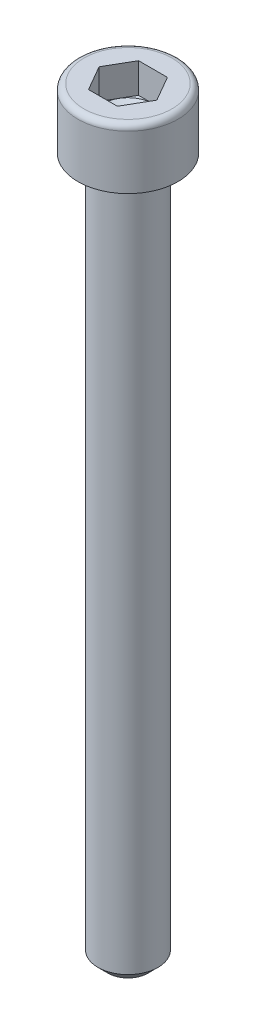
ISO-10303-21;
HEADER;
FILE_DESCRIPTION(('STEP AP214'),'2;1');
FILE_NAME('part.step','',(''),(''),'','','');
FILE_SCHEMA(('AUTOMOTIVE_DESIGN { 1 0 10303 214 1 1 1 1 }'));
ENDSEC;
DATA;
#1=APPLICATION_CONTEXT('core data for automotive mechanical design processes');
#2=APPLICATION_PROTOCOL_DEFINITION('international standard','automotive_design',2000,#1);
#3=PRODUCT_CONTEXT('',#1,'mechanical');
#4=PRODUCT('Part','Part','',(#3));
#5=PRODUCT_RELATED_PRODUCT_CATEGORY('part','',(#4));
#6=PRODUCT_DEFINITION_FORMATION('','',#4);
#7=PRODUCT_DEFINITION_CONTEXT('part definition',#1,'design');
#8=PRODUCT_DEFINITION('design','',#6,#7);
#9=PRODUCT_DEFINITION_SHAPE('','',#8);
#10=(LENGTH_UNIT() NAMED_UNIT(*) SI_UNIT(.MILLI.,.METRE.));
#11=(NAMED_UNIT(*) PLANE_ANGLE_UNIT() SI_UNIT($,.RADIAN.));
#12=(NAMED_UNIT(*) SI_UNIT($,.STERADIAN.) SOLID_ANGLE_UNIT());
#13=UNCERTAINTY_MEASURE_WITH_UNIT(LENGTH_MEASURE(1.E-05),#10,'distance_accuracy_value','');
#14=(GEOMETRIC_REPRESENTATION_CONTEXT(3) GLOBAL_UNCERTAINTY_ASSIGNED_CONTEXT((#13)) GLOBAL_UNIT_ASSIGNED_CONTEXT((#10,
#11,#12)) REPRESENTATION_CONTEXT('',''));
#15=CARTESIAN_POINT('',(0.,0.,0.));
#16=DIRECTION('',(0.,0.,1.));
#17=DIRECTION('',(1.,0.,0.));
#18=AXIS2_PLACEMENT_3D('',#15,#16,#17);
#19=CARTESIAN_POINT('',(2.5,6.,0.));
#20=DIRECTION('',(0.,-1.,0.));
#21=DIRECTION('',(1.,0.,0.));
#22=AXIS2_PLACEMENT_3D('',#19,#20,#21);
#23=PLANE('',#22);
#24=CARTESIAN_POINT('',(0.,6.,0.));
#25=DIRECTION('',(0.,1.,0.));
#26=DIRECTION('',(-1.,0.,0.));
#27=AXIS2_PLACEMENT_3D('',#24,#25,#26);
#28=CIRCLE('',#27,4.4);
#29=CARTESIAN_POINT('',(-4.4,6.,0.));
#30=VERTEX_POINT('',#29);
#31=EDGE_CURVE('E173',#30,#30,#28,.T.);
#32=ORIENTED_EDGE('',*,*,#31,.T.);
#33=EDGE_LOOP('',(#32));
#34=FACE_BOUND('',#33,.T.);
#35=DIRECTION('',(0.499999999999997,0.,0.86602540378444));
#36=VECTOR('',#35,1.);
#37=CARTESIAN_POINT('',(1.44337567297407,6.,-2.5));
#38=LINE('',#37,#36);
#39=CARTESIAN_POINT('',(1.44337567297407,6.,-2.5));
#40=VERTEX_POINT('',#39);
#41=CARTESIAN_POINT('',(2.88675134594812,6.,0.));
#42=VERTEX_POINT('',#41);
#43=EDGE_CURVE('E114',#40,#42,#38,.T.);
#44=ORIENTED_EDGE('',*,*,#43,.T.);
#45=DIRECTION('',(-0.499999999999997,0.,0.86602540378444));
#46=VECTOR('',#45,1.);
#47=CARTESIAN_POINT('',(1.44337567297407,6.,2.5));
#48=LINE('',#47,#46);
#49=CARTESIAN_POINT('',(1.44337567297407,6.,2.5));
#50=VERTEX_POINT('',#49);
#51=EDGE_CURVE('E132',#42,#50,#48,.T.);
#52=ORIENTED_EDGE('',*,*,#51,.T.);
#53=DIRECTION('',(-1.,0.,0.));
#54=VECTOR('',#53,1.);
#55=CARTESIAN_POINT('',(1.44337567297407,6.,2.5));
#56=LINE('',#55,#54);
#57=CARTESIAN_POINT('',(-1.44337567297407,6.,2.5));
#58=VERTEX_POINT('',#57);
#59=EDGE_CURVE('E135',#50,#58,#56,.T.);
#60=ORIENTED_EDGE('',*,*,#59,.T.);
#61=DIRECTION('',(-0.499999999999997,0.,-0.86602540378444));
#62=VECTOR('',#61,1.);
#63=CARTESIAN_POINT('',(-1.44337567297407,6.,2.5));
#64=LINE('',#63,#62);
#65=CARTESIAN_POINT('',(-2.88675134594812,6.,0.));
#66=VERTEX_POINT('',#65);
#67=EDGE_CURVE('E128',#58,#66,#64,.T.);
#68=ORIENTED_EDGE('',*,*,#67,.T.);
#69=DIRECTION('',(0.499999999999997,0.,-0.86602540378444));
#70=VECTOR('',#69,1.);
#71=CARTESIAN_POINT('',(-1.44337567297407,6.,-2.5));
#72=LINE('',#71,#70);
#73=CARTESIAN_POINT('',(-1.44337567297407,6.,-2.5));
#74=VERTEX_POINT('',#73);
#75=EDGE_CURVE('E115',#66,#74,#72,.T.);
#76=ORIENTED_EDGE('',*,*,#75,.T.);
#77=DIRECTION('',(1.,0.,0.));
#78=VECTOR('',#77,1.);
#79=CARTESIAN_POINT('',(1.44337567297407,6.,-2.5));
#80=LINE('',#79,#78);
#81=EDGE_CURVE('E105',#74,#40,#80,.T.);
#82=ORIENTED_EDGE('',*,*,#81,.T.);
#83=EDGE_LOOP('',(#44,#52,#60,#68,#76,#82));
#84=FACE_BOUND('',#83,.T.);
#85=ADVANCED_FACE('F34',(#34,#84),#23,.F.);
#86=CARTESIAN_POINT('',(0.,-70.,0.));
#87=DIRECTION('',(0.,1.,0.));
#88=DIRECTION('',(0.,0.,1.));
#89=AXIS2_PLACEMENT_3D('',#86,#87,#88);
#90=CYLINDRICAL_SURFACE('',#89,3.);
#91=CARTESIAN_POINT('',(0.,-69.,0.));
#92=DIRECTION('',(0.,1.,0.));
#93=DIRECTION('',(0.,0.,1.));
#94=AXIS2_PLACEMENT_3D('',#91,#92,#93);
#95=CIRCLE('',#94,3.);
#96=CARTESIAN_POINT('',(0.,-69.,3.));
#97=VERTEX_POINT('',#96);
#98=EDGE_CURVE('E42',#97,#97,#95,.T.);
#99=ORIENTED_EDGE('',*,*,#98,.T.);
#100=EDGE_LOOP('',(#99));
#101=FACE_BOUND('',#100,.T.);
#102=CARTESIAN_POINT('',(0.,0.,0.));
#103=DIRECTION('',(0.,1.,0.));
#104=DIRECTION('',(0.,0.,1.));
#105=AXIS2_PLACEMENT_3D('',#102,#103,#104);
#106=CIRCLE('',#105,3.);
#107=CARTESIAN_POINT('',(0.,0.,3.));
#108=VERTEX_POINT('',#107);
#109=EDGE_CURVE('E183',#108,#108,#106,.T.);
#110=ORIENTED_EDGE('',*,*,#109,.F.);
#111=EDGE_LOOP('',(#110));
#112=FACE_BOUND('',#111,.T.);
#113=ADVANCED_FACE('F36',(#101,#112),#90,.T.);
#114=CARTESIAN_POINT('',(0.,-70.,0.));
#115=DIRECTION('',(0.,1.,0.));
#116=DIRECTION('',(0.,0.,1.));
#117=AXIS2_PLACEMENT_3D('',#114,#115,#116);
#118=PLANE('',#117);
#119=CARTESIAN_POINT('',(0.,-70.,0.));
#120=DIRECTION('',(0.,1.,0.));
#121=DIRECTION('',(0.,0.,1.));
#122=AXIS2_PLACEMENT_3D('',#119,#120,#121);
#123=CIRCLE('',#122,2.);
#124=CARTESIAN_POINT('',(0.,-70.,2.));
#125=VERTEX_POINT('',#124);
#126=EDGE_CURVE('E11',#125,#125,#123,.F.);
#127=ORIENTED_EDGE('',*,*,#126,.T.);
#128=EDGE_LOOP('',(#127));
#129=FACE_BOUND('',#128,.T.);
#130=ADVANCED_FACE('F193',(#129),#118,.F.);
#131=CARTESIAN_POINT('',(0.,-69.,0.));
#132=DIRECTION('',(0.,1.,0.));
#133=DIRECTION('',(0.,0.,1.));
#134=AXIS2_PLACEMENT_3D('',#131,#132,#133);
#135=CONICAL_SURFACE('',#134,3.,0.785398163397441);
#136=ORIENTED_EDGE('',*,*,#126,.F.);
#137=EDGE_LOOP('',(#136));
#138=FACE_BOUND('',#137,.T.);
#139=ORIENTED_EDGE('',*,*,#98,.F.);
#140=EDGE_LOOP('',(#139));
#141=FACE_BOUND('',#140,.T.);
#142=ADVANCED_FACE('F190',(#138,#141),#135,.T.);
#143=CARTESIAN_POINT('',(0.,0.,0.));
#144=DIRECTION('',(0.,1.,0.));
#145=DIRECTION('',(-1.,0.,0.));
#146=AXIS2_PLACEMENT_3D('',#143,#144,#145);
#147=PLANE('',#146);
#148=ORIENTED_EDGE('',*,*,#109,.T.);
#149=EDGE_LOOP('',(#148));
#150=FACE_BOUND('',#149,.T.);
#151=CARTESIAN_POINT('',(0.,0.,0.));
#152=DIRECTION('',(0.,1.,0.));
#153=DIRECTION('',(-1.,0.,0.));
#154=AXIS2_PLACEMENT_3D('',#151,#152,#153);
#155=CIRCLE('',#154,5.);
#156=CARTESIAN_POINT('',(-5.,0.,0.));
#157=VERTEX_POINT('',#156);
#158=EDGE_CURVE('E180',#157,#157,#155,.T.);
#159=ORIENTED_EDGE('',*,*,#158,.F.);
#160=EDGE_LOOP('',(#159));
#161=FACE_BOUND('',#160,.T.);
#162=ADVANCED_FACE('F192',(#150,#161),#147,.F.);
#163=CARTESIAN_POINT('',(0.,6.,0.));
#164=DIRECTION('',(0.,1.,0.));
#165=DIRECTION('',(-1.,0.,0.));
#166=AXIS2_PLACEMENT_3D('',#163,#164,#165);
#167=CYLINDRICAL_SURFACE('',#166,5.);
#168=CARTESIAN_POINT('',(0.,5.4,0.));
#169=DIRECTION('',(0.,1.,0.));
#170=DIRECTION('',(-1.,0.,0.));
#171=AXIS2_PLACEMENT_3D('',#168,#169,#170);
#172=CIRCLE('',#171,5.);
#173=CARTESIAN_POINT('',(-5.,5.4,0.));
#174=VERTEX_POINT('',#173);
#175=EDGE_CURVE('E177',#174,#174,#172,.T.);
#176=ORIENTED_EDGE('',*,*,#175,.F.);
#177=EDGE_LOOP('',(#176));
#178=FACE_BOUND('',#177,.T.);
#179=ORIENTED_EDGE('',*,*,#158,.T.);
#180=EDGE_LOOP('',(#179));
#181=FACE_BOUND('',#180,.T.);
#182=ADVANCED_FACE('F200',(#178,#181),#167,.T.);
#183=CARTESIAN_POINT('',(0.,5.4,0.));
#184=DIRECTION('',(0.,1.,0.));
#185=DIRECTION('',(-1.,0.,0.));
#186=AXIS2_PLACEMENT_3D('',#183,#184,#185);
#187=TOROIDAL_SURFACE('',#186,4.4,0.6);
#188=ORIENTED_EDGE('',*,*,#31,.F.);
#189=EDGE_LOOP('',(#188));
#190=FACE_BOUND('',#189,.T.);
#191=ORIENTED_EDGE('',*,*,#175,.T.);
#192=EDGE_LOOP('',(#191));
#193=FACE_BOUND('',#192,.T.);
#194=ADVANCED_FACE('F215',(#190,#193),#187,.T.);
#195=CARTESIAN_POINT('',(-1.44337567297407,3.,-2.5));
#196=DIRECTION('',(0.86602540378444,0.,0.499999999999998));
#197=DIRECTION('',(0.499999999999998,0.,-0.86602540378444));
#198=AXIS2_PLACEMENT_3D('',#195,#196,#197);
#199=PLANE('',#198);
#200=ORIENTED_EDGE('',*,*,#75,.F.);
#201=DIRECTION('',(0.,1.,0.));
#202=VECTOR('',#201,1.);
#203=CARTESIAN_POINT('',(-2.88675134594812,3.,0.));
#204=LINE('',#203,#202);
#205=CARTESIAN_POINT('',(-2.88675134594812,3.,0.));
#206=VERTEX_POINT('',#205);
#207=EDGE_CURVE('E158',#206,#66,#204,.T.);
#208=ORIENTED_EDGE('',*,*,#207,.F.);
#209=DIRECTION('',(0.499999999999997,0.,-0.86602540378444));
#210=VECTOR('',#209,1.);
#211=CARTESIAN_POINT('',(-1.44337567297407,3.,-2.5));
#212=LINE('',#211,#210);
#213=CARTESIAN_POINT('',(-2.1650635094611,3.,-1.24999999999999));
#214=VERTEX_POINT('',#213);
#215=EDGE_CURVE('E138',#206,#214,#212,.T.);
#216=ORIENTED_EDGE('',*,*,#215,.T.);
#217=CARTESIAN_POINT('',(-1.44337567297407,3.,-2.5));
#218=VERTEX_POINT('',#217);
#219=EDGE_CURVE('E123',#214,#218,#212,.T.);
#220=ORIENTED_EDGE('',*,*,#219,.T.);
#221=DIRECTION('',(0.,1.,0.));
#222=VECTOR('',#221,1.);
#223=CARTESIAN_POINT('',(-1.44337567297407,3.,-2.5));
#224=LINE('',#223,#222);
#225=EDGE_CURVE('E108',#218,#74,#224,.T.);
#226=ORIENTED_EDGE('',*,*,#225,.T.);
#227=EDGE_LOOP('',(#200,#208,#216,#220,#226));
#228=FACE_BOUND('',#227,.T.);
#229=ADVANCED_FACE('F118',(#228),#199,.T.);
#230=CARTESIAN_POINT('',(1.44337567297407,3.,-2.5));
#231=DIRECTION('',(0.,0.,1.));
#232=DIRECTION('',(1.,0.,0.));
#233=AXIS2_PLACEMENT_3D('',#230,#231,#232);
#234=PLANE('',#233);
#235=ORIENTED_EDGE('',*,*,#81,.F.);
#236=ORIENTED_EDGE('',*,*,#225,.F.);
#237=DIRECTION('',(1.,0.,0.));
#238=VECTOR('',#237,1.);
#239=CARTESIAN_POINT('',(1.44337567297407,3.,-2.5));
#240=LINE('',#239,#238);
#241=CARTESIAN_POINT('',(0.,3.,-2.5));
#242=VERTEX_POINT('',#241);
#243=EDGE_CURVE('E49',#218,#242,#240,.T.);
#244=ORIENTED_EDGE('',*,*,#243,.T.);
#245=CARTESIAN_POINT('',(1.44337567297407,3.,-2.5));
#246=VERTEX_POINT('',#245);
#247=EDGE_CURVE('E140',#242,#246,#240,.T.);
#248=ORIENTED_EDGE('',*,*,#247,.T.);
#249=DIRECTION('',(0.,1.,0.));
#250=VECTOR('',#249,1.);
#251=CARTESIAN_POINT('',(1.44337567297407,3.,-2.5));
#252=LINE('',#251,#250);
#253=EDGE_CURVE('E110',#246,#40,#252,.T.);
#254=ORIENTED_EDGE('',*,*,#253,.T.);
#255=EDGE_LOOP('',(#235,#236,#244,#248,#254));
#256=FACE_BOUND('',#255,.T.);
#257=ADVANCED_FACE('F107',(#256),#234,.T.);
#258=CARTESIAN_POINT('',(1.44337567297407,3.,-2.5));
#259=DIRECTION('',(-0.86602540378444,0.,0.499999999999997));
#260=DIRECTION('',(0.499999999999997,0.,0.86602540378444));
#261=AXIS2_PLACEMENT_3D('',#258,#259,#260);
#262=PLANE('',#261);
#263=ORIENTED_EDGE('',*,*,#43,.F.);
#264=ORIENTED_EDGE('',*,*,#253,.F.);
#265=DIRECTION('',(0.499999999999997,0.,0.86602540378444));
#266=VECTOR('',#265,1.);
#267=CARTESIAN_POINT('',(1.44337567297407,3.,-2.5));
#268=LINE('',#267,#266);
#269=CARTESIAN_POINT('',(2.1650635094611,3.,-1.24999999999999));
#270=VERTEX_POINT('',#269);
#271=EDGE_CURVE('E143',#246,#270,#268,.T.);
#272=ORIENTED_EDGE('',*,*,#271,.T.);
#273=CARTESIAN_POINT('',(2.88675134594812,3.,0.));
#274=VERTEX_POINT('',#273);
#275=EDGE_CURVE('E142',#270,#274,#268,.T.);
#276=ORIENTED_EDGE('',*,*,#275,.T.);
#277=DIRECTION('',(0.,1.,0.));
#278=VECTOR('',#277,1.);
#279=CARTESIAN_POINT('',(2.88675134594812,3.,0.));
#280=LINE('',#279,#278);
#281=EDGE_CURVE('E166',#274,#42,#280,.T.);
#282=ORIENTED_EDGE('',*,*,#281,.T.);
#283=EDGE_LOOP('',(#263,#264,#272,#276,#282));
#284=FACE_BOUND('',#283,.T.);
#285=ADVANCED_FACE('F245',(#284),#262,.T.);
#286=CARTESIAN_POINT('',(1.44337567297407,3.,2.5));
#287=DIRECTION('',(-0.86602540378444,0.,-0.499999999999997));
#288=DIRECTION('',(-0.499999999999997,0.,0.86602540378444));
#289=AXIS2_PLACEMENT_3D('',#286,#287,#288);
#290=PLANE('',#289);
#291=ORIENTED_EDGE('',*,*,#51,.F.);
#292=ORIENTED_EDGE('',*,*,#281,.F.);
#293=DIRECTION('',(-0.499999999999997,0.,0.86602540378444));
#294=VECTOR('',#293,1.);
#295=CARTESIAN_POINT('',(1.44337567297407,3.,2.5));
#296=LINE('',#295,#294);
#297=CARTESIAN_POINT('',(2.1650635094611,3.,1.24999999999999));
#298=VERTEX_POINT('',#297);
#299=EDGE_CURVE('E147',#274,#298,#296,.T.);
#300=ORIENTED_EDGE('',*,*,#299,.T.);
#301=CARTESIAN_POINT('',(1.44337567297407,3.,2.5));
#302=VERTEX_POINT('',#301);
#303=EDGE_CURVE('E146',#298,#302,#296,.T.);
#304=ORIENTED_EDGE('',*,*,#303,.T.);
#305=DIRECTION('',(0.,1.,0.));
#306=VECTOR('',#305,1.);
#307=CARTESIAN_POINT('',(1.44337567297407,3.,2.5));
#308=LINE('',#307,#306);
#309=EDGE_CURVE('E163',#302,#50,#308,.T.);
#310=ORIENTED_EDGE('',*,*,#309,.T.);
#311=EDGE_LOOP('',(#291,#292,#300,#304,#310));
#312=FACE_BOUND('',#311,.T.);
#313=ADVANCED_FACE('F252',(#312),#290,.T.);
#314=CARTESIAN_POINT('',(1.44337567297407,3.,2.5));
#315=DIRECTION('',(0.,0.,-1.));
#316=DIRECTION('',(-1.,0.,0.));
#317=AXIS2_PLACEMENT_3D('',#314,#315,#316);
#318=PLANE('',#317);
#319=ORIENTED_EDGE('',*,*,#59,.F.);
#320=ORIENTED_EDGE('',*,*,#309,.F.);
#321=DIRECTION('',(-1.,0.,0.));
#322=VECTOR('',#321,1.);
#323=CARTESIAN_POINT('',(1.44337567297407,3.,2.5));
#324=LINE('',#323,#322);
#325=CARTESIAN_POINT('',(0.,3.,2.5));
#326=VERTEX_POINT('',#325);
#327=EDGE_CURVE('E151',#302,#326,#324,.T.);
#328=ORIENTED_EDGE('',*,*,#327,.T.);
#329=CARTESIAN_POINT('',(-1.44337567297407,3.,2.5));
#330=VERTEX_POINT('',#329);
#331=EDGE_CURVE('E150',#326,#330,#324,.T.);
#332=ORIENTED_EDGE('',*,*,#331,.T.);
#333=DIRECTION('',(0.,1.,0.));
#334=VECTOR('',#333,1.);
#335=CARTESIAN_POINT('',(-1.44337567297407,3.,2.5));
#336=LINE('',#335,#334);
#337=EDGE_CURVE('E160',#330,#58,#336,.T.);
#338=ORIENTED_EDGE('',*,*,#337,.T.);
#339=EDGE_LOOP('',(#319,#320,#328,#332,#338));
#340=FACE_BOUND('',#339,.T.);
#341=ADVANCED_FACE('F260',(#340),#318,.T.);
#342=CARTESIAN_POINT('',(-1.44337567297407,3.,2.5));
#343=DIRECTION('',(0.86602540378444,0.,-0.499999999999997));
#344=DIRECTION('',(-0.499999999999997,0.,-0.86602540378444));
#345=AXIS2_PLACEMENT_3D('',#342,#343,#344);
#346=PLANE('',#345);
#347=ORIENTED_EDGE('',*,*,#67,.F.);
#348=ORIENTED_EDGE('',*,*,#337,.F.);
#349=DIRECTION('',(-0.499999999999997,0.,-0.86602540378444));
#350=VECTOR('',#349,1.);
#351=CARTESIAN_POINT('',(-1.44337567297407,3.,2.5));
#352=LINE('',#351,#350);
#353=CARTESIAN_POINT('',(-2.1650635094611,3.,1.24999999999999));
#354=VERTEX_POINT('',#353);
#355=EDGE_CURVE('E155',#330,#354,#352,.T.);
#356=ORIENTED_EDGE('',*,*,#355,.T.);
#357=EDGE_CURVE('E154',#354,#206,#352,.T.);
#358=ORIENTED_EDGE('',*,*,#357,.T.);
#359=ORIENTED_EDGE('',*,*,#207,.T.);
#360=EDGE_LOOP('',(#347,#348,#356,#358,#359));
#361=FACE_BOUND('',#360,.T.);
#362=ADVANCED_FACE('F268',(#361),#346,.T.);
#363=CARTESIAN_POINT('',(-4.33012701892218,3.,2.5));
#364=DIRECTION('',(0.,-1.,0.));
#365=DIRECTION('',(0.,0.,-1.));
#366=AXIS2_PLACEMENT_3D('',#363,#364,#365);
#367=PLANE('',#366);
#368=ORIENTED_EDGE('',*,*,#243,.F.);
#369=ORIENTED_EDGE('',*,*,#219,.F.);
#370=CARTESIAN_POINT('',(0.,3.,0.));
#371=DIRECTION('',(0.,1.,0.));
#372=DIRECTION('',(-1.,0.,0.));
#373=AXIS2_PLACEMENT_3D('',#370,#371,#372);
#374=CIRCLE('',#373,2.5);
#375=EDGE_CURVE('E401',#242,#214,#374,.T.);
#376=ORIENTED_EDGE('',*,*,#375,.F.);
#377=EDGE_LOOP('',(#368,#369,#376));
#378=FACE_BOUND('',#377,.T.);
#379=ADVANCED_FACE('F276',(#378),#367,.F.);
#380=ORIENTED_EDGE('',*,*,#215,.F.);
#381=ORIENTED_EDGE('',*,*,#357,.F.);
#382=EDGE_CURVE('E124',#214,#354,#374,.T.);
#383=ORIENTED_EDGE('',*,*,#382,.F.);
#384=EDGE_LOOP('',(#380,#381,#383));
#385=FACE_BOUND('',#384,.T.);
#386=ADVANCED_FACE('F284',(#385),#367,.F.);
#387=ORIENTED_EDGE('',*,*,#355,.F.);
#388=ORIENTED_EDGE('',*,*,#331,.F.);
#389=EDGE_CURVE('E170',#354,#326,#374,.T.);
#390=ORIENTED_EDGE('',*,*,#389,.F.);
#391=EDGE_LOOP('',(#387,#388,#390));
#392=FACE_BOUND('',#391,.T.);
#393=ADVANCED_FACE('F293',(#392),#367,.F.);
#394=ORIENTED_EDGE('',*,*,#327,.F.);
#395=ORIENTED_EDGE('',*,*,#303,.F.);
#396=EDGE_CURVE('E174',#326,#298,#374,.T.);
#397=ORIENTED_EDGE('',*,*,#396,.F.);
#398=EDGE_LOOP('',(#394,#395,#397));
#399=FACE_BOUND('',#398,.T.);
#400=ADVANCED_FACE('F300',(#399),#367,.F.);
#401=ORIENTED_EDGE('',*,*,#299,.F.);
#402=ORIENTED_EDGE('',*,*,#275,.F.);
#403=EDGE_CURVE('E396',#298,#270,#374,.T.);
#404=ORIENTED_EDGE('',*,*,#403,.F.);
#405=EDGE_LOOP('',(#401,#402,#404));
#406=FACE_BOUND('',#405,.T.);
#407=ADVANCED_FACE('F307',(#406),#367,.F.);
#408=ORIENTED_EDGE('',*,*,#271,.F.);
#409=ORIENTED_EDGE('',*,*,#247,.F.);
#410=EDGE_CURVE('E399',#270,#242,#374,.T.);
#411=ORIENTED_EDGE('',*,*,#410,.F.);
#412=EDGE_LOOP('',(#408,#409,#411));
#413=FACE_BOUND('',#412,.T.);
#414=ADVANCED_FACE('F287',(#413),#367,.F.);
#415=CARTESIAN_POINT('',(0.,3.,0.));
#416=DIRECTION('',(0.,1.,0.));
#417=DIRECTION('',(-1.,0.,0.));
#418=AXIS2_PLACEMENT_3D('',#415,#416,#417);
#419=CONICAL_SURFACE('',#418,2.5,1.04719755119659);
#420=CARTESIAN_POINT('',(0.,1.55662432702592,0.));
#421=VERTEX_POINT('',#420);
#422=VERTEX_LOOP('',#421);
#423=FACE_BOUND('',#422,.T.);
#424=ORIENTED_EDGE('',*,*,#389,.T.);
#425=ORIENTED_EDGE('',*,*,#396,.T.);
#426=ORIENTED_EDGE('',*,*,#403,.T.);
#427=ORIENTED_EDGE('',*,*,#410,.T.);
#428=ORIENTED_EDGE('',*,*,#375,.T.);
#429=ORIENTED_EDGE('',*,*,#382,.T.);
#430=EDGE_LOOP('',(#424,#425,#426,#427,#428,#429));
#431=FACE_BOUND('',#430,.T.);
#432=ADVANCED_FACE('F213',(#423,#431),#419,.F.);
#433=CLOSED_SHELL('',(#85,#113,#130,#142,#162,#182,#194,#229,#257,#285,#313,#341,#362,#379,#386,
#393,#400,#407,#414,#432));
#434=MANIFOLD_SOLID_BREP('B2',#433);
#435=ADVANCED_BREP_SHAPE_REPRESENTATION('',(#18,#434),#14);
#436=SHAPE_DEFINITION_REPRESENTATION(#9,#435);
ENDSEC;
END-ISO-10303-21;
